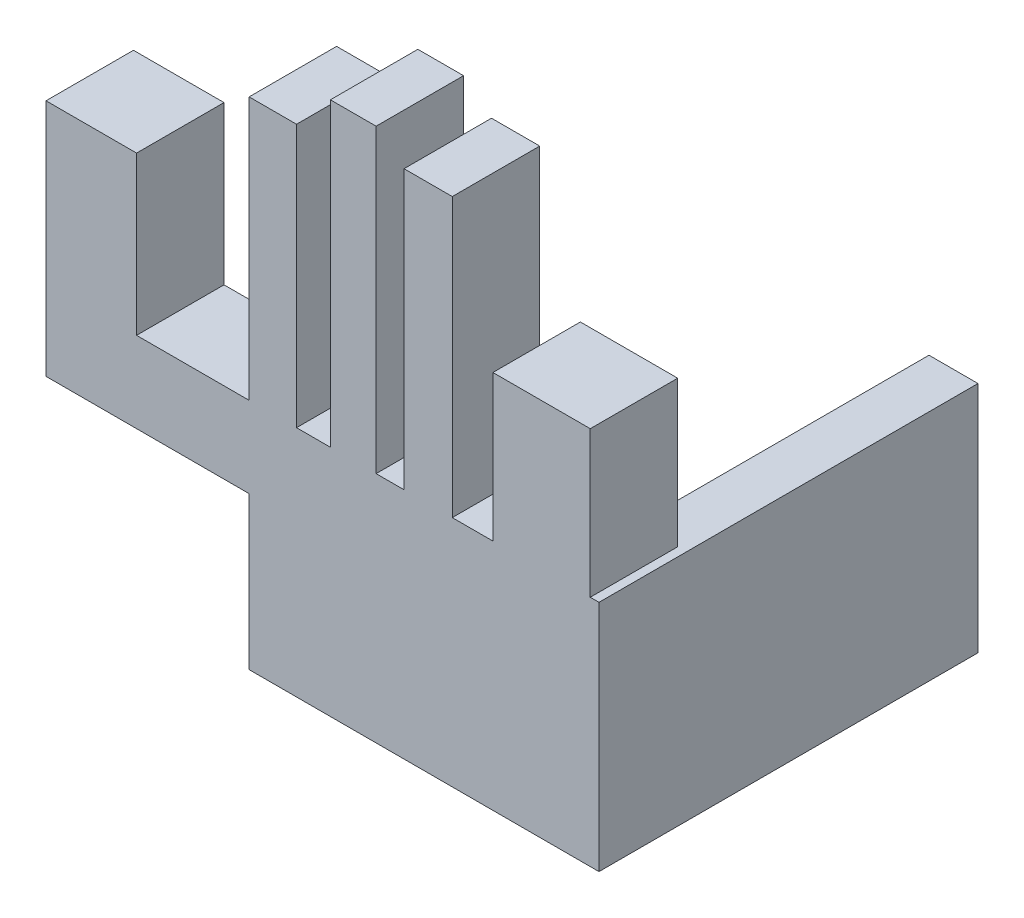
ISO-10303-21;
HEADER;
FILE_DESCRIPTION(('STEP AP214'),'2;1');
FILE_NAME('part.step','',(''),(''),'','','');
FILE_SCHEMA(('AUTOMOTIVE_DESIGN { 1 0 10303 214 1 1 1 1 }'));
ENDSEC;
DATA;
#1=APPLICATION_CONTEXT('core data for automotive mechanical design processes');
#2=APPLICATION_PROTOCOL_DEFINITION('international standard','automotive_design',2000,#1);
#3=PRODUCT_CONTEXT('',#1,'mechanical');
#4=PRODUCT('Part','Part','',(#3));
#5=PRODUCT_RELATED_PRODUCT_CATEGORY('part','',(#4));
#6=PRODUCT_DEFINITION_FORMATION('','',#4);
#7=PRODUCT_DEFINITION_CONTEXT('part definition',#1,'design');
#8=PRODUCT_DEFINITION('design','',#6,#7);
#9=PRODUCT_DEFINITION_SHAPE('','',#8);
#10=(LENGTH_UNIT() NAMED_UNIT(*) SI_UNIT(.MILLI.,.METRE.));
#11=(NAMED_UNIT(*) PLANE_ANGLE_UNIT() SI_UNIT($,.RADIAN.));
#12=(NAMED_UNIT(*) SI_UNIT($,.STERADIAN.) SOLID_ANGLE_UNIT());
#13=UNCERTAINTY_MEASURE_WITH_UNIT(LENGTH_MEASURE(1.E-05),#10,'distance_accuracy_value','');
#14=(GEOMETRIC_REPRESENTATION_CONTEXT(3) GLOBAL_UNCERTAINTY_ASSIGNED_CONTEXT((#13)) GLOBAL_UNIT_ASSIGNED_CONTEXT((#10,
#11,#12)) REPRESENTATION_CONTEXT('',''));
#15=CARTESIAN_POINT('',(0.,0.,0.));
#16=DIRECTION('',(0.,0.,1.));
#17=DIRECTION('',(1.,0.,0.));
#18=AXIS2_PLACEMENT_3D('',#15,#16,#17);
#19=CARTESIAN_POINT('',(0.,0.,15.));
#20=DIRECTION('',(1.,0.,0.));
#21=DIRECTION('',(0.,0.,-1.));
#22=AXIS2_PLACEMENT_3D('',#19,#20,#21);
#23=PLANE('',#22);
#24=DIRECTION('',(0.,-1.,0.));
#25=VECTOR('',#24,1.);
#26=CARTESIAN_POINT('',(0.,0.,0.));
#27=LINE('',#26,#25);
#28=CARTESIAN_POINT('',(0.,45.0725806451613,0.));
#29=VERTEX_POINT('',#28);
#30=CARTESIAN_POINT('',(0.,0.,0.));
#31=VERTEX_POINT('',#30);
#32=EDGE_CURVE('E288',#29,#31,#27,.T.);
#33=ORIENTED_EDGE('',*,*,#32,.T.);
#34=DIRECTION('',(0.,0.,-1.));
#35=VECTOR('',#34,1.);
#36=CARTESIAN_POINT('',(0.,0.,15.));
#37=LINE('',#36,#35);
#38=CARTESIAN_POINT('',(0.,0.,15.));
#39=VERTEX_POINT('',#38);
#40=EDGE_CURVE('E11',#39,#31,#37,.T.);
#41=ORIENTED_EDGE('',*,*,#40,.F.);
#42=DIRECTION('',(0.,-1.,0.));
#43=VECTOR('',#42,1.);
#44=CARTESIAN_POINT('',(0.,0.,15.));
#45=LINE('',#44,#43);
#46=CARTESIAN_POINT('',(0.,45.0725806451613,15.));
#47=VERTEX_POINT('',#46);
#48=EDGE_CURVE('E289',#47,#39,#45,.T.);
#49=ORIENTED_EDGE('',*,*,#48,.F.);
#50=DIRECTION('',(0.,0.,-1.));
#51=VECTOR('',#50,1.);
#52=CARTESIAN_POINT('',(0.,45.0725806451613,15.));
#53=LINE('',#52,#51);
#54=EDGE_CURVE('E339',#47,#29,#53,.T.);
#55=ORIENTED_EDGE('',*,*,#54,.T.);
#56=EDGE_LOOP('',(#33,#41,#49,#55));
#57=FACE_BOUND('',#56,.T.);
#58=ADVANCED_FACE('F33',(#57),#23,.F.);
#59=CARTESIAN_POINT('',(0.,0.,15.));
#60=DIRECTION('',(0.,-1.,0.));
#61=DIRECTION('',(0.,0.,-1.));
#62=AXIS2_PLACEMENT_3D('',#59,#60,#61);
#63=PLANE('',#62);
#64=DIRECTION('',(-1.,0.,0.));
#65=VECTOR('',#64,1.);
#66=CARTESIAN_POINT('',(0.,0.,0.));
#67=LINE('',#66,#65);
#68=CARTESIAN_POINT('',(-19.3064516129032,0.,0.));
#69=VERTEX_POINT('',#68);
#70=EDGE_CURVE('E342',#31,#69,#67,.T.);
#71=ORIENTED_EDGE('',*,*,#70,.T.);
#72=DIRECTION('',(0.,0.,-1.));
#73=VECTOR('',#72,1.);
#74=CARTESIAN_POINT('',(-19.3064516129032,0.,15.));
#75=LINE('',#74,#73);
#76=CARTESIAN_POINT('',(-19.3064516129032,0.,15.));
#77=VERTEX_POINT('',#76);
#78=EDGE_CURVE('E40',#77,#69,#75,.T.);
#79=ORIENTED_EDGE('',*,*,#78,.F.);
#80=DIRECTION('',(-1.,0.,0.));
#81=VECTOR('',#80,1.);
#82=CARTESIAN_POINT('',(0.,0.,15.));
#83=LINE('',#82,#81);
#84=EDGE_CURVE('E292',#39,#77,#83,.T.);
#85=ORIENTED_EDGE('',*,*,#84,.F.);
#86=ORIENTED_EDGE('',*,*,#40,.T.);
#87=EDGE_LOOP('',(#71,#79,#85,#86));
#88=FACE_BOUND('',#87,.T.);
#89=ADVANCED_FACE('F471',(#88),#63,.F.);
#90=CARTESIAN_POINT('',(-19.3064516129032,0.,15.));
#91=DIRECTION('',(-1.,0.,0.));
#92=DIRECTION('',(0.,0.,1.));
#93=AXIS2_PLACEMENT_3D('',#90,#91,#92);
#94=PLANE('',#93);
#95=DIRECTION('',(0.,1.,0.));
#96=VECTOR('',#95,1.);
#97=CARTESIAN_POINT('',(-19.3064516129032,0.,0.));
#98=LINE('',#97,#96);
#99=CARTESIAN_POINT('',(-19.3064516129032,27.0725806451613,0.));
#100=VERTEX_POINT('',#99);
#101=EDGE_CURVE('E344',#69,#100,#98,.T.);
#102=ORIENTED_EDGE('',*,*,#101,.T.);
#103=DIRECTION('',(0.,0.,-1.));
#104=VECTOR('',#103,1.);
#105=CARTESIAN_POINT('',(-19.3064516129032,27.0725806451613,15.));
#106=LINE('',#105,#104);
#107=CARTESIAN_POINT('',(-19.3064516129032,27.0725806451613,15.));
#108=VERTEX_POINT('',#107);
#109=EDGE_CURVE('E443',#108,#100,#106,.T.);
#110=ORIENTED_EDGE('',*,*,#109,.F.);
#111=DIRECTION('',(0.,1.,0.));
#112=VECTOR('',#111,1.);
#113=CARTESIAN_POINT('',(-19.3064516129032,0.,15.));
#114=LINE('',#113,#112);
#115=EDGE_CURVE('E295',#77,#108,#114,.T.);
#116=ORIENTED_EDGE('',*,*,#115,.F.);
#117=ORIENTED_EDGE('',*,*,#78,.T.);
#118=EDGE_LOOP('',(#102,#110,#116,#117));
#119=FACE_BOUND('',#118,.T.);
#120=ADVANCED_FACE('F450',(#119),#94,.F.);
#121=CARTESIAN_POINT('',(-34.8387096774194,27.0725806451613,15.));
#122=DIRECTION('',(0.,-1.,0.));
#123=DIRECTION('',(0.,0.,-1.));
#124=AXIS2_PLACEMENT_3D('',#121,#122,#123);
#125=PLANE('',#124);
#126=DIRECTION('',(-1.,0.,0.));
#127=VECTOR('',#126,1.);
#128=CARTESIAN_POINT('',(-34.8387096774194,27.0725806451613,0.));
#129=LINE('',#128,#127);
#130=CARTESIAN_POINT('',(-34.8387096774194,27.0725806451613,0.));
#131=VERTEX_POINT('',#130);
#132=EDGE_CURVE('E346',#100,#131,#129,.T.);
#133=ORIENTED_EDGE('',*,*,#132,.T.);
#134=DIRECTION('',(0.,0.,-1.));
#135=VECTOR('',#134,1.);
#136=CARTESIAN_POINT('',(-34.8387096774194,27.0725806451613,15.));
#137=LINE('',#136,#135);
#138=CARTESIAN_POINT('',(-34.8387096774194,27.0725806451613,15.));
#139=VERTEX_POINT('',#138);
#140=EDGE_CURVE('E440',#139,#131,#137,.T.);
#141=ORIENTED_EDGE('',*,*,#140,.F.);
#142=DIRECTION('',(-1.,0.,0.));
#143=VECTOR('',#142,1.);
#144=CARTESIAN_POINT('',(-34.8387096774194,27.0725806451613,15.));
#145=LINE('',#144,#143);
#146=EDGE_CURVE('E297',#108,#139,#145,.T.);
#147=ORIENTED_EDGE('',*,*,#146,.F.);
#148=ORIENTED_EDGE('',*,*,#109,.T.);
#149=EDGE_LOOP('',(#133,#141,#147,#148));
#150=FACE_BOUND('',#149,.T.);
#151=ADVANCED_FACE('F459',(#150),#125,.F.);
#152=CARTESIAN_POINT('',(-34.8387096774194,0.,15.));
#153=DIRECTION('',(1.,0.,0.));
#154=DIRECTION('',(0.,0.,-1.));
#155=AXIS2_PLACEMENT_3D('',#152,#153,#154);
#156=PLANE('',#155);
#157=DIRECTION('',(0.,-1.,0.));
#158=VECTOR('',#157,1.);
#159=CARTESIAN_POINT('',(-34.8387096774194,0.,0.));
#160=LINE('',#159,#158);
#161=CARTESIAN_POINT('',(-34.8387096774194,-13.8629032258065,0.));
#162=VERTEX_POINT('',#161);
#163=EDGE_CURVE('E349',#131,#162,#160,.T.);
#164=ORIENTED_EDGE('',*,*,#163,.T.);
#165=DIRECTION('',(0.,0.,-1.));
#166=VECTOR('',#165,1.);
#167=CARTESIAN_POINT('',(-34.8387096774194,-13.8629032258065,15.));
#168=LINE('',#167,#166);
#169=CARTESIAN_POINT('',(-34.8387096774194,-13.8629032258065,15.));
#170=VERTEX_POINT('',#169);
#171=EDGE_CURVE('E437',#170,#162,#168,.T.);
#172=ORIENTED_EDGE('',*,*,#171,.F.);
#173=DIRECTION('',(0.,-1.,0.));
#174=VECTOR('',#173,1.);
#175=CARTESIAN_POINT('',(-34.8387096774194,0.,15.));
#176=LINE('',#175,#174);
#177=EDGE_CURVE('E299',#139,#170,#176,.T.);
#178=ORIENTED_EDGE('',*,*,#177,.F.);
#179=ORIENTED_EDGE('',*,*,#140,.T.);
#180=EDGE_LOOP('',(#164,#172,#178,#179));
#181=FACE_BOUND('',#180,.T.);
#182=ADVANCED_FACE('F463',(#181),#156,.F.);
#183=CARTESIAN_POINT('',(0.,-13.8629032258065,15.));
#184=DIRECTION('',(0.,1.,0.));
#185=DIRECTION('',(0.,0.,1.));
#186=AXIS2_PLACEMENT_3D('',#183,#184,#185);
#187=PLANE('',#186);
#188=DIRECTION('',(1.,0.,0.));
#189=VECTOR('',#188,1.);
#190=CARTESIAN_POINT('',(0.,-13.8629032258065,0.));
#191=LINE('',#190,#189);
#192=CARTESIAN_POINT('',(0.,-13.8629032258065,0.));
#193=VERTEX_POINT('',#192);
#194=EDGE_CURVE('E351',#162,#193,#191,.T.);
#195=ORIENTED_EDGE('',*,*,#194,.T.);
#196=DIRECTION('',(0.,0.,-1.));
#197=VECTOR('',#196,1.);
#198=CARTESIAN_POINT('',(0.,-13.8629032258065,15.));
#199=LINE('',#198,#197);
#200=CARTESIAN_POINT('',(0.,-13.8629032258065,15.));
#201=VERTEX_POINT('',#200);
#202=EDGE_CURVE('E434',#201,#193,#199,.T.);
#203=ORIENTED_EDGE('',*,*,#202,.F.);
#204=DIRECTION('',(1.,0.,0.));
#205=VECTOR('',#204,1.);
#206=CARTESIAN_POINT('',(0.,-13.8629032258065,15.));
#207=LINE('',#206,#205);
#208=EDGE_CURVE('E301',#170,#201,#207,.T.);
#209=ORIENTED_EDGE('',*,*,#208,.F.);
#210=ORIENTED_EDGE('',*,*,#171,.T.);
#211=EDGE_LOOP('',(#195,#203,#209,#210));
#212=FACE_BOUND('',#211,.T.);
#213=ADVANCED_FACE('F564',(#212),#187,.F.);
#214=CARTESIAN_POINT('',(0.,-13.8629032258065,15.));
#215=DIRECTION('',(1.,0.,0.));
#216=DIRECTION('',(0.,1.,0.));
#217=AXIS2_PLACEMENT_3D('',#214,#215,#216);
#218=PLANE('',#217);
#219=DIRECTION('',(0.,-1.,0.));
#220=VECTOR('',#219,1.);
#221=CARTESIAN_POINT('',(0.,-13.8629032258065,0.));
#222=LINE('',#221,#220);
#223=CARTESIAN_POINT('',(0.,-40.,0.));
#224=VERTEX_POINT('',#223);
#225=EDGE_CURVE('E353',#193,#224,#222,.T.);
#226=ORIENTED_EDGE('',*,*,#225,.T.);
#227=DIRECTION('',(0.,0.,-1.));
#228=VECTOR('',#227,1.);
#229=CARTESIAN_POINT('',(0.,-40.,15.));
#230=LINE('',#229,#228);
#231=CARTESIAN_POINT('',(0.,-40.,15.));
#232=VERTEX_POINT('',#231);
#233=EDGE_CURVE('E431',#232,#224,#230,.T.);
#234=ORIENTED_EDGE('',*,*,#233,.F.);
#235=DIRECTION('',(0.,-1.,0.));
#236=VECTOR('',#235,1.);
#237=CARTESIAN_POINT('',(0.,-13.8629032258065,15.));
#238=LINE('',#237,#236);
#239=EDGE_CURVE('E303',#201,#232,#238,.T.);
#240=ORIENTED_EDGE('',*,*,#239,.F.);
#241=ORIENTED_EDGE('',*,*,#202,.T.);
#242=EDGE_LOOP('',(#226,#234,#240,#241));
#243=FACE_BOUND('',#242,.T.);
#244=ADVANCED_FACE('F561',(#243),#218,.F.);
#245=CARTESIAN_POINT('',(0.,-40.,15.));
#246=DIRECTION('',(0.,1.,0.));
#247=DIRECTION('',(0.,0.,1.));
#248=AXIS2_PLACEMENT_3D('',#245,#246,#247);
#249=PLANE('',#248);
#250=DIRECTION('',(1.,0.,0.));
#251=VECTOR('',#250,1.);
#252=CARTESIAN_POINT('',(0.,-40.,0.));
#253=LINE('',#252,#251);
#254=CARTESIAN_POINT('',(51.5954666608115,-40.,0.));
#255=VERTEX_POINT('',#254);
#256=EDGE_CURVE('E355',#224,#255,#253,.T.);
#257=ORIENTED_EDGE('',*,*,#256,.T.);
#258=DIRECTION('',(0.,0.,1.));
#259=VECTOR('',#258,1.);
#260=CARTESIAN_POINT('',(51.5954666608115,-40.,-50.));
#261=LINE('',#260,#259);
#262=CARTESIAN_POINT('',(51.5954666608115,-40.,-50.));
#263=VERTEX_POINT('',#262);
#264=EDGE_CURVE('E285',#263,#255,#261,.T.);
#265=ORIENTED_EDGE('',*,*,#264,.F.);
#266=DIRECTION('',(-1.,0.,0.));
#267=VECTOR('',#266,1.);
#268=CARTESIAN_POINT('',(60.,-40.,-50.));
#269=LINE('',#268,#267);
#270=CARTESIAN_POINT('',(60.,-40.,-50.));
#271=VERTEX_POINT('',#270);
#272=EDGE_CURVE('E271',#271,#263,#269,.T.);
#273=ORIENTED_EDGE('',*,*,#272,.F.);
#274=DIRECTION('',(0.,0.,-1.));
#275=VECTOR('',#274,1.);
#276=CARTESIAN_POINT('',(60.,-40.,15.));
#277=LINE('',#276,#275);
#278=CARTESIAN_POINT('',(60.,-40.,15.));
#279=VERTEX_POINT('',#278);
#280=EDGE_CURVE('E429',#279,#271,#277,.T.);
#281=ORIENTED_EDGE('',*,*,#280,.F.);
#282=DIRECTION('',(1.,0.,0.));
#283=VECTOR('',#282,1.);
#284=CARTESIAN_POINT('',(0.,-40.,15.));
#285=LINE('',#284,#283);
#286=EDGE_CURVE('E305',#232,#279,#285,.T.);
#287=ORIENTED_EDGE('',*,*,#286,.F.);
#288=ORIENTED_EDGE('',*,*,#233,.T.);
#289=EDGE_LOOP('',(#257,#265,#273,#281,#287,#288));
#290=FACE_BOUND('',#289,.T.);
#291=ADVANCED_FACE('F555',(#290),#249,.F.);
#292=CARTESIAN_POINT('',(60.,0.,15.));
#293=DIRECTION('',(-1.,0.,0.));
#294=DIRECTION('',(0.,-1.,0.));
#295=AXIS2_PLACEMENT_3D('',#292,#293,#294);
#296=PLANE('',#295);
#297=ORIENTED_EDGE('',*,*,#280,.T.);
#298=DIRECTION('',(0.,-1.,0.));
#299=VECTOR('',#298,1.);
#300=CARTESIAN_POINT('',(60.,0.,-50.));
#301=LINE('',#300,#299);
#302=CARTESIAN_POINT('',(60.,0.,-50.));
#303=VERTEX_POINT('',#302);
#304=EDGE_CURVE('E268',#303,#271,#301,.T.);
#305=ORIENTED_EDGE('',*,*,#304,.F.);
#306=DIRECTION('',(0.,0.,-1.));
#307=VECTOR('',#306,1.);
#308=CARTESIAN_POINT('',(60.,0.,15.));
#309=LINE('',#308,#307);
#310=CARTESIAN_POINT('',(60.,0.,15.));
#311=VERTEX_POINT('',#310);
#312=EDGE_CURVE('E427',#311,#303,#309,.T.);
#313=ORIENTED_EDGE('',*,*,#312,.F.);
#314=DIRECTION('',(0.,1.,0.));
#315=VECTOR('',#314,1.);
#316=CARTESIAN_POINT('',(60.,0.,15.));
#317=LINE('',#316,#315);
#318=EDGE_CURVE('E307',#279,#311,#317,.T.);
#319=ORIENTED_EDGE('',*,*,#318,.F.);
#320=EDGE_LOOP('',(#297,#305,#313,#319));
#321=FACE_BOUND('',#320,.T.);
#322=ADVANCED_FACE('F728',(#321),#296,.F.);
#323=CARTESIAN_POINT('',(58.5,0.,15.));
#324=DIRECTION('',(0.,-1.,0.));
#325=DIRECTION('',(0.,0.,-1.));
#326=AXIS2_PLACEMENT_3D('',#323,#324,#325);
#327=PLANE('',#326);
#328=ORIENTED_EDGE('',*,*,#312,.T.);
#329=DIRECTION('',(1.,0.,0.));
#330=VECTOR('',#329,1.);
#331=CARTESIAN_POINT('',(60.,0.,-50.));
#332=LINE('',#331,#330);
#333=CARTESIAN_POINT('',(51.5954666608115,0.,-50.));
#334=VERTEX_POINT('',#333);
#335=EDGE_CURVE('E276',#334,#303,#332,.T.);
#336=ORIENTED_EDGE('',*,*,#335,.F.);
#337=DIRECTION('',(0.,0.,1.));
#338=VECTOR('',#337,1.);
#339=CARTESIAN_POINT('',(51.5954666608115,0.,-50.));
#340=LINE('',#339,#338);
#341=CARTESIAN_POINT('',(51.5954666608115,0.,0.));
#342=VERTEX_POINT('',#341);
#343=EDGE_CURVE('E279',#334,#342,#340,.T.);
#344=ORIENTED_EDGE('',*,*,#343,.T.);
#345=DIRECTION('',(1.,0.,0.));
#346=VECTOR('',#345,1.);
#347=CARTESIAN_POINT('',(60.,0.,0.));
#348=LINE('',#347,#346);
#349=CARTESIAN_POINT('',(58.5,0.,0.));
#350=VERTEX_POINT('',#349);
#351=EDGE_CURVE('E272',#342,#350,#348,.T.);
#352=ORIENTED_EDGE('',*,*,#351,.T.);
#353=DIRECTION('',(0.,0.,-1.));
#354=VECTOR('',#353,1.);
#355=CARTESIAN_POINT('',(58.5,0.,15.));
#356=LINE('',#355,#354);
#357=CARTESIAN_POINT('',(58.5,0.,15.));
#358=VERTEX_POINT('',#357);
#359=EDGE_CURVE('E425',#358,#350,#356,.T.);
#360=ORIENTED_EDGE('',*,*,#359,.F.);
#361=DIRECTION('',(-1.,0.,0.));
#362=VECTOR('',#361,1.);
#363=CARTESIAN_POINT('',(58.5,0.,15.));
#364=LINE('',#363,#362);
#365=EDGE_CURVE('E309',#311,#358,#364,.T.);
#366=ORIENTED_EDGE('',*,*,#365,.F.);
#367=EDGE_LOOP('',(#328,#336,#344,#352,#360,#366));
#368=FACE_BOUND('',#367,.T.);
#369=ADVANCED_FACE('F546',(#368),#327,.F.);
#370=CARTESIAN_POINT('',(58.5,0.,15.));
#371=DIRECTION('',(-1.,0.,0.));
#372=DIRECTION('',(0.,0.,1.));
#373=AXIS2_PLACEMENT_3D('',#370,#371,#372);
#374=PLANE('',#373);
#375=DIRECTION('',(0.,1.,0.));
#376=VECTOR('',#375,1.);
#377=CARTESIAN_POINT('',(58.5,0.,0.));
#378=LINE('',#377,#376);
#379=CARTESIAN_POINT('',(58.5,25.0403225806452,0.));
#380=VERTEX_POINT('',#379);
#381=EDGE_CURVE('E357',#350,#380,#378,.T.);
#382=ORIENTED_EDGE('',*,*,#381,.T.);
#383=DIRECTION('',(0.,0.,-1.));
#384=VECTOR('',#383,1.);
#385=CARTESIAN_POINT('',(58.5,25.0403225806452,15.));
#386=LINE('',#385,#384);
#387=CARTESIAN_POINT('',(58.5,25.0403225806452,15.));
#388=VERTEX_POINT('',#387);
#389=EDGE_CURVE('E422',#388,#380,#386,.T.);
#390=ORIENTED_EDGE('',*,*,#389,.F.);
#391=DIRECTION('',(0.,1.,0.));
#392=VECTOR('',#391,1.);
#393=CARTESIAN_POINT('',(58.5,0.,15.));
#394=LINE('',#393,#392);
#395=EDGE_CURVE('E311',#358,#388,#394,.T.);
#396=ORIENTED_EDGE('',*,*,#395,.F.);
#397=ORIENTED_EDGE('',*,*,#359,.T.);
#398=EDGE_LOOP('',(#382,#390,#396,#397));
#399=FACE_BOUND('',#398,.T.);
#400=ADVANCED_FACE('F542',(#399),#374,.F.);
#401=CARTESIAN_POINT('',(41.8064516129033,25.0403225806452,15.));
#402=DIRECTION('',(0.,-1.,0.));
#403=DIRECTION('',(0.,0.,-1.));
#404=AXIS2_PLACEMENT_3D('',#401,#402,#403);
#405=PLANE('',#404);
#406=DIRECTION('',(-1.,0.,0.));
#407=VECTOR('',#406,1.);
#408=CARTESIAN_POINT('',(41.8064516129033,25.0403225806452,0.));
#409=LINE('',#408,#407);
#410=CARTESIAN_POINT('',(41.8064516129033,25.0403225806452,0.));
#411=VERTEX_POINT('',#410);
#412=EDGE_CURVE('E359',#380,#411,#409,.T.);
#413=ORIENTED_EDGE('',*,*,#412,.T.);
#414=DIRECTION('',(0.,0.,-1.));
#415=VECTOR('',#414,1.);
#416=CARTESIAN_POINT('',(41.8064516129033,25.0403225806452,15.));
#417=LINE('',#416,#415);
#418=CARTESIAN_POINT('',(41.8064516129033,25.0403225806452,15.));
#419=VERTEX_POINT('',#418);
#420=EDGE_CURVE('E419',#419,#411,#417,.T.);
#421=ORIENTED_EDGE('',*,*,#420,.F.);
#422=DIRECTION('',(-1.,0.,0.));
#423=VECTOR('',#422,1.);
#424=CARTESIAN_POINT('',(41.8064516129033,25.0403225806452,15.));
#425=LINE('',#424,#423);
#426=EDGE_CURVE('E313',#388,#419,#425,.T.);
#427=ORIENTED_EDGE('',*,*,#426,.F.);
#428=ORIENTED_EDGE('',*,*,#389,.T.);
#429=EDGE_LOOP('',(#413,#421,#427,#428));
#430=FACE_BOUND('',#429,.T.);
#431=ADVANCED_FACE('F537',(#430),#405,.F.);
#432=CARTESIAN_POINT('',(41.8064516129033,0.,15.));
#433=DIRECTION('',(1.,0.,0.));
#434=DIRECTION('',(0.,0.,-1.));
#435=AXIS2_PLACEMENT_3D('',#432,#433,#434);
#436=PLANE('',#435);
#437=DIRECTION('',(0.,-1.,0.));
#438=VECTOR('',#437,1.);
#439=CARTESIAN_POINT('',(41.8064516129033,0.,0.));
#440=LINE('',#439,#438);
#441=CARTESIAN_POINT('',(41.8064516129033,0.,0.));
#442=VERTEX_POINT('',#441);
#443=EDGE_CURVE('E361',#411,#442,#440,.T.);
#444=ORIENTED_EDGE('',*,*,#443,.T.);
#445=DIRECTION('',(0.,0.,-1.));
#446=VECTOR('',#445,1.);
#447=CARTESIAN_POINT('',(41.8064516129033,0.,15.));
#448=LINE('',#447,#446);
#449=CARTESIAN_POINT('',(41.8064516129033,0.,15.));
#450=VERTEX_POINT('',#449);
#451=EDGE_CURVE('E416',#450,#442,#448,.T.);
#452=ORIENTED_EDGE('',*,*,#451,.F.);
#453=DIRECTION('',(0.,-1.,0.));
#454=VECTOR('',#453,1.);
#455=CARTESIAN_POINT('',(41.8064516129033,0.,15.));
#456=LINE('',#455,#454);
#457=EDGE_CURVE('E315',#419,#450,#456,.T.);
#458=ORIENTED_EDGE('',*,*,#457,.F.);
#459=ORIENTED_EDGE('',*,*,#420,.T.);
#460=EDGE_LOOP('',(#444,#452,#458,#459));
#461=FACE_BOUND('',#460,.T.);
#462=ADVANCED_FACE('F532',(#461),#436,.F.);
#463=CARTESIAN_POINT('',(34.8387096774194,0.,15.));
#464=DIRECTION('',(0.,-1.,0.));
#465=DIRECTION('',(0.,0.,-1.));
#466=AXIS2_PLACEMENT_3D('',#463,#464,#465);
#467=PLANE('',#466);
#468=DIRECTION('',(-1.,0.,0.));
#469=VECTOR('',#468,1.);
#470=CARTESIAN_POINT('',(34.8387096774194,0.,0.));
#471=LINE('',#470,#469);
#472=CARTESIAN_POINT('',(34.8387096774194,0.,0.));
#473=VERTEX_POINT('',#472);
#474=EDGE_CURVE('E363',#442,#473,#471,.T.);
#475=ORIENTED_EDGE('',*,*,#474,.T.);
#476=DIRECTION('',(0.,0.,-1.));
#477=VECTOR('',#476,1.);
#478=CARTESIAN_POINT('',(34.8387096774194,0.,15.));
#479=LINE('',#478,#477);
#480=CARTESIAN_POINT('',(34.8387096774194,0.,15.));
#481=VERTEX_POINT('',#480);
#482=EDGE_CURVE('E413',#481,#473,#479,.T.);
#483=ORIENTED_EDGE('',*,*,#482,.F.);
#484=DIRECTION('',(-1.,0.,0.));
#485=VECTOR('',#484,1.);
#486=CARTESIAN_POINT('',(34.8387096774194,0.,15.));
#487=LINE('',#486,#485);
#488=EDGE_CURVE('E317',#450,#481,#487,.T.);
#489=ORIENTED_EDGE('',*,*,#488,.F.);
#490=ORIENTED_EDGE('',*,*,#451,.T.);
#491=EDGE_LOOP('',(#475,#483,#489,#490));
#492=FACE_BOUND('',#491,.T.);
#493=ADVANCED_FACE('F528',(#492),#467,.F.);
#494=CARTESIAN_POINT('',(34.8387096774194,0.,15.));
#495=DIRECTION('',(-1.,0.,0.));
#496=DIRECTION('',(0.,0.,1.));
#497=AXIS2_PLACEMENT_3D('',#494,#495,#496);
#498=PLANE('',#497);
#499=DIRECTION('',(0.,1.,0.));
#500=VECTOR('',#499,1.);
#501=CARTESIAN_POINT('',(34.8387096774194,0.,0.));
#502=LINE('',#501,#500);
#503=CARTESIAN_POINT('',(34.8387096774194,47.6854838709678,0.));
#504=VERTEX_POINT('',#503);
#505=EDGE_CURVE('E365',#473,#504,#502,.T.);
#506=ORIENTED_EDGE('',*,*,#505,.T.);
#507=DIRECTION('',(0.,0.,-1.));
#508=VECTOR('',#507,1.);
#509=CARTESIAN_POINT('',(34.8387096774194,47.6854838709678,15.));
#510=LINE('',#509,#508);
#511=CARTESIAN_POINT('',(34.8387096774194,47.6854838709678,15.));
#512=VERTEX_POINT('',#511);
#513=EDGE_CURVE('E410',#512,#504,#510,.T.);
#514=ORIENTED_EDGE('',*,*,#513,.F.);
#515=DIRECTION('',(0.,1.,0.));
#516=VECTOR('',#515,1.);
#517=CARTESIAN_POINT('',(34.8387096774194,0.,15.));
#518=LINE('',#517,#516);
#519=EDGE_CURVE('E319',#481,#512,#518,.T.);
#520=ORIENTED_EDGE('',*,*,#519,.F.);
#521=ORIENTED_EDGE('',*,*,#482,.T.);
#522=EDGE_LOOP('',(#506,#514,#520,#521));
#523=FACE_BOUND('',#522,.T.);
#524=ADVANCED_FACE('F523',(#523),#498,.F.);
#525=CARTESIAN_POINT('',(26.5645161290323,47.6854838709678,15.));
#526=DIRECTION('',(0.,-1.,0.));
#527=DIRECTION('',(0.,0.,-1.));
#528=AXIS2_PLACEMENT_3D('',#525,#526,#527);
#529=PLANE('',#528);
#530=DIRECTION('',(-1.,0.,0.));
#531=VECTOR('',#530,1.);
#532=CARTESIAN_POINT('',(26.5645161290323,47.6854838709678,0.));
#533=LINE('',#532,#531);
#534=CARTESIAN_POINT('',(26.5645161290323,47.6854838709678,0.));
#535=VERTEX_POINT('',#534);
#536=EDGE_CURVE('E367',#504,#535,#533,.T.);
#537=ORIENTED_EDGE('',*,*,#536,.T.);
#538=DIRECTION('',(0.,0.,-1.));
#539=VECTOR('',#538,1.);
#540=CARTESIAN_POINT('',(26.5645161290323,47.6854838709678,15.));
#541=LINE('',#540,#539);
#542=CARTESIAN_POINT('',(26.5645161290323,47.6854838709678,15.));
#543=VERTEX_POINT('',#542);
#544=EDGE_CURVE('E407',#543,#535,#541,.T.);
#545=ORIENTED_EDGE('',*,*,#544,.F.);
#546=DIRECTION('',(-1.,0.,0.));
#547=VECTOR('',#546,1.);
#548=CARTESIAN_POINT('',(26.5645161290323,47.6854838709678,15.));
#549=LINE('',#548,#547);
#550=EDGE_CURVE('E321',#512,#543,#549,.T.);
#551=ORIENTED_EDGE('',*,*,#550,.F.);
#552=ORIENTED_EDGE('',*,*,#513,.T.);
#553=EDGE_LOOP('',(#537,#545,#551,#552));
#554=FACE_BOUND('',#553,.T.);
#555=ADVANCED_FACE('F517',(#554),#529,.F.);
#556=CARTESIAN_POINT('',(26.5645161290323,0.,15.));
#557=DIRECTION('',(1.,0.,0.));
#558=DIRECTION('',(0.,0.,-1.));
#559=AXIS2_PLACEMENT_3D('',#556,#557,#558);
#560=PLANE('',#559);
#561=DIRECTION('',(0.,-1.,0.));
#562=VECTOR('',#561,1.);
#563=CARTESIAN_POINT('',(26.5645161290323,0.,0.));
#564=LINE('',#563,#562);
#565=CARTESIAN_POINT('',(26.5645161290323,0.,0.));
#566=VERTEX_POINT('',#565);
#567=EDGE_CURVE('E369',#535,#566,#564,.T.);
#568=ORIENTED_EDGE('',*,*,#567,.T.);
#569=DIRECTION('',(0.,0.,-1.));
#570=VECTOR('',#569,1.);
#571=CARTESIAN_POINT('',(26.5645161290323,0.,15.));
#572=LINE('',#571,#570);
#573=CARTESIAN_POINT('',(26.5645161290323,0.,15.));
#574=VERTEX_POINT('',#573);
#575=EDGE_CURVE('E404',#574,#566,#572,.T.);
#576=ORIENTED_EDGE('',*,*,#575,.F.);
#577=DIRECTION('',(0.,-1.,0.));
#578=VECTOR('',#577,1.);
#579=CARTESIAN_POINT('',(26.5645161290323,0.,15.));
#580=LINE('',#579,#578);
#581=EDGE_CURVE('E323',#543,#574,#580,.T.);
#582=ORIENTED_EDGE('',*,*,#581,.F.);
#583=ORIENTED_EDGE('',*,*,#544,.T.);
#584=EDGE_LOOP('',(#568,#576,#582,#583));
#585=FACE_BOUND('',#584,.T.);
#586=ADVANCED_FACE('F513',(#585),#560,.F.);
#587=CARTESIAN_POINT('',(21.7741935483871,0.,15.));
#588=DIRECTION('',(0.,-1.,0.));
#589=DIRECTION('',(0.,0.,-1.));
#590=AXIS2_PLACEMENT_3D('',#587,#588,#589);
#591=PLANE('',#590);
#592=DIRECTION('',(-1.,0.,0.));
#593=VECTOR('',#592,1.);
#594=CARTESIAN_POINT('',(21.7741935483871,0.,0.));
#595=LINE('',#594,#593);
#596=CARTESIAN_POINT('',(21.7741935483871,0.,0.));
#597=VERTEX_POINT('',#596);
#598=EDGE_CURVE('E371',#566,#597,#595,.T.);
#599=ORIENTED_EDGE('',*,*,#598,.T.);
#600=DIRECTION('',(0.,0.,-1.));
#601=VECTOR('',#600,1.);
#602=CARTESIAN_POINT('',(21.7741935483871,0.,15.));
#603=LINE('',#602,#601);
#604=CARTESIAN_POINT('',(21.7741935483871,0.,15.));
#605=VERTEX_POINT('',#604);
#606=EDGE_CURVE('E401',#605,#597,#603,.T.);
#607=ORIENTED_EDGE('',*,*,#606,.F.);
#608=DIRECTION('',(-1.,0.,0.));
#609=VECTOR('',#608,1.);
#610=CARTESIAN_POINT('',(21.7741935483871,0.,15.));
#611=LINE('',#610,#609);
#612=EDGE_CURVE('E325',#574,#605,#611,.T.);
#613=ORIENTED_EDGE('',*,*,#612,.F.);
#614=ORIENTED_EDGE('',*,*,#575,.T.);
#615=EDGE_LOOP('',(#599,#607,#613,#614));
#616=FACE_BOUND('',#615,.T.);
#617=ADVANCED_FACE('F508',(#616),#591,.F.);
#618=CARTESIAN_POINT('',(21.7741935483871,0.,15.));
#619=DIRECTION('',(-1.,0.,0.));
#620=DIRECTION('',(0.,0.,1.));
#621=AXIS2_PLACEMENT_3D('',#618,#619,#620);
#622=PLANE('',#621);
#623=DIRECTION('',(0.,1.,0.));
#624=VECTOR('',#623,1.);
#625=CARTESIAN_POINT('',(21.7741935483871,0.,0.));
#626=LINE('',#625,#624);
#627=CARTESIAN_POINT('',(21.7741935483871,51.6048387096774,0.));
#628=VERTEX_POINT('',#627);
#629=EDGE_CURVE('E373',#597,#628,#626,.T.);
#630=ORIENTED_EDGE('',*,*,#629,.T.);
#631=DIRECTION('',(0.,0.,-1.));
#632=VECTOR('',#631,1.);
#633=CARTESIAN_POINT('',(21.7741935483871,51.6048387096774,15.));
#634=LINE('',#633,#632);
#635=CARTESIAN_POINT('',(21.7741935483871,51.6048387096774,15.));
#636=VERTEX_POINT('',#635);
#637=EDGE_CURVE('E398',#636,#628,#634,.T.);
#638=ORIENTED_EDGE('',*,*,#637,.F.);
#639=DIRECTION('',(0.,1.,0.));
#640=VECTOR('',#639,1.);
#641=CARTESIAN_POINT('',(21.7741935483871,0.,15.));
#642=LINE('',#641,#640);
#643=EDGE_CURVE('E327',#605,#636,#642,.T.);
#644=ORIENTED_EDGE('',*,*,#643,.F.);
#645=ORIENTED_EDGE('',*,*,#606,.T.);
#646=EDGE_LOOP('',(#630,#638,#644,#645));
#647=FACE_BOUND('',#646,.T.);
#648=ADVANCED_FACE('F502',(#647),#622,.F.);
#649=CARTESIAN_POINT('',(13.9354838709677,51.6048387096774,15.));
#650=DIRECTION('',(0.,-1.,0.));
#651=DIRECTION('',(0.,0.,-1.));
#652=AXIS2_PLACEMENT_3D('',#649,#650,#651);
#653=PLANE('',#652);
#654=DIRECTION('',(-1.,0.,0.));
#655=VECTOR('',#654,1.);
#656=CARTESIAN_POINT('',(13.9354838709677,51.6048387096774,0.));
#657=LINE('',#656,#655);
#658=CARTESIAN_POINT('',(13.9354838709677,51.6048387096774,0.));
#659=VERTEX_POINT('',#658);
#660=EDGE_CURVE('E375',#628,#659,#657,.T.);
#661=ORIENTED_EDGE('',*,*,#660,.T.);
#662=DIRECTION('',(0.,0.,-1.));
#663=VECTOR('',#662,1.);
#664=CARTESIAN_POINT('',(13.9354838709677,51.6048387096774,15.));
#665=LINE('',#664,#663);
#666=CARTESIAN_POINT('',(13.9354838709677,51.6048387096774,15.));
#667=VERTEX_POINT('',#666);
#668=EDGE_CURVE('E395',#667,#659,#665,.T.);
#669=ORIENTED_EDGE('',*,*,#668,.F.);
#670=DIRECTION('',(-1.,0.,0.));
#671=VECTOR('',#670,1.);
#672=CARTESIAN_POINT('',(13.9354838709677,51.6048387096774,15.));
#673=LINE('',#672,#671);
#674=EDGE_CURVE('E329',#636,#667,#673,.T.);
#675=ORIENTED_EDGE('',*,*,#674,.F.);
#676=ORIENTED_EDGE('',*,*,#637,.T.);
#677=EDGE_LOOP('',(#661,#669,#675,#676));
#678=FACE_BOUND('',#677,.T.);
#679=ADVANCED_FACE('F498',(#678),#653,.F.);
#680=CARTESIAN_POINT('',(13.9354838709677,0.,15.));
#681=DIRECTION('',(1.,0.,0.));
#682=DIRECTION('',(0.,0.,-1.));
#683=AXIS2_PLACEMENT_3D('',#680,#681,#682);
#684=PLANE('',#683);
#685=DIRECTION('',(0.,-1.,0.));
#686=VECTOR('',#685,1.);
#687=CARTESIAN_POINT('',(13.9354838709677,0.,0.));
#688=LINE('',#687,#686);
#689=CARTESIAN_POINT('',(13.9354838709677,0.,0.));
#690=VERTEX_POINT('',#689);
#691=EDGE_CURVE('E377',#659,#690,#688,.T.);
#692=ORIENTED_EDGE('',*,*,#691,.T.);
#693=DIRECTION('',(0.,0.,-1.));
#694=VECTOR('',#693,1.);
#695=CARTESIAN_POINT('',(13.9354838709677,0.,15.));
#696=LINE('',#695,#694);
#697=CARTESIAN_POINT('',(13.9354838709677,0.,15.));
#698=VERTEX_POINT('',#697);
#699=EDGE_CURVE('E392',#698,#690,#696,.T.);
#700=ORIENTED_EDGE('',*,*,#699,.F.);
#701=DIRECTION('',(0.,-1.,0.));
#702=VECTOR('',#701,1.);
#703=CARTESIAN_POINT('',(13.9354838709677,0.,15.));
#704=LINE('',#703,#702);
#705=EDGE_CURVE('E331',#667,#698,#704,.T.);
#706=ORIENTED_EDGE('',*,*,#705,.F.);
#707=ORIENTED_EDGE('',*,*,#668,.T.);
#708=EDGE_LOOP('',(#692,#700,#706,#707));
#709=FACE_BOUND('',#708,.T.);
#710=ADVANCED_FACE('F493',(#709),#684,.F.);
#711=CARTESIAN_POINT('',(8.12903225806452,0.,15.));
#712=DIRECTION('',(0.,-1.,0.));
#713=DIRECTION('',(0.,0.,-1.));
#714=AXIS2_PLACEMENT_3D('',#711,#712,#713);
#715=PLANE('',#714);
#716=DIRECTION('',(-1.,0.,0.));
#717=VECTOR('',#716,1.);
#718=CARTESIAN_POINT('',(8.12903225806452,0.,0.));
#719=LINE('',#718,#717);
#720=CARTESIAN_POINT('',(8.12903225806452,0.,0.));
#721=VERTEX_POINT('',#720);
#722=EDGE_CURVE('E379',#690,#721,#719,.T.);
#723=ORIENTED_EDGE('',*,*,#722,.T.);
#724=DIRECTION('',(0.,0.,-1.));
#725=VECTOR('',#724,1.);
#726=CARTESIAN_POINT('',(8.12903225806452,0.,15.));
#727=LINE('',#726,#725);
#728=CARTESIAN_POINT('',(8.12903225806452,0.,15.));
#729=VERTEX_POINT('',#728);
#730=EDGE_CURVE('E389',#729,#721,#727,.T.);
#731=ORIENTED_EDGE('',*,*,#730,.F.);
#732=DIRECTION('',(-1.,0.,0.));
#733=VECTOR('',#732,1.);
#734=CARTESIAN_POINT('',(8.12903225806452,0.,15.));
#735=LINE('',#734,#733);
#736=EDGE_CURVE('E333',#698,#729,#735,.T.);
#737=ORIENTED_EDGE('',*,*,#736,.F.);
#738=ORIENTED_EDGE('',*,*,#699,.T.);
#739=EDGE_LOOP('',(#723,#731,#737,#738));
#740=FACE_BOUND('',#739,.T.);
#741=ADVANCED_FACE('F487',(#740),#715,.F.);
#742=CARTESIAN_POINT('',(8.12903225806452,0.,15.));
#743=DIRECTION('',(-1.,0.,0.));
#744=DIRECTION('',(0.,0.,1.));
#745=AXIS2_PLACEMENT_3D('',#742,#743,#744);
#746=PLANE('',#745);
#747=DIRECTION('',(0.,1.,0.));
#748=VECTOR('',#747,1.);
#749=CARTESIAN_POINT('',(8.12903225806452,0.,0.));
#750=LINE('',#749,#748);
#751=CARTESIAN_POINT('',(8.12903225806452,45.0725806451613,0.));
#752=VERTEX_POINT('',#751);
#753=EDGE_CURVE('E381',#721,#752,#750,.T.);
#754=ORIENTED_EDGE('',*,*,#753,.T.);
#755=DIRECTION('',(0.,0.,-1.));
#756=VECTOR('',#755,1.);
#757=CARTESIAN_POINT('',(8.12903225806452,45.0725806451613,15.));
#758=LINE('',#757,#756);
#759=CARTESIAN_POINT('',(8.12903225806452,45.0725806451613,15.));
#760=VERTEX_POINT('',#759);
#761=EDGE_CURVE('E386',#760,#752,#758,.T.);
#762=ORIENTED_EDGE('',*,*,#761,.F.);
#763=DIRECTION('',(0.,1.,0.));
#764=VECTOR('',#763,1.);
#765=CARTESIAN_POINT('',(8.12903225806452,0.,15.));
#766=LINE('',#765,#764);
#767=EDGE_CURVE('E335',#729,#760,#766,.T.);
#768=ORIENTED_EDGE('',*,*,#767,.F.);
#769=ORIENTED_EDGE('',*,*,#730,.T.);
#770=EDGE_LOOP('',(#754,#762,#768,#769));
#771=FACE_BOUND('',#770,.T.);
#772=ADVANCED_FACE('F483',(#771),#746,.F.);
#773=CARTESIAN_POINT('',(0.,45.0725806451613,15.));
#774=DIRECTION('',(0.,-1.,0.));
#775=DIRECTION('',(0.,0.,-1.));
#776=AXIS2_PLACEMENT_3D('',#773,#774,#775);
#777=PLANE('',#776);
#778=DIRECTION('',(-1.,0.,0.));
#779=VECTOR('',#778,1.);
#780=CARTESIAN_POINT('',(0.,45.0725806451613,0.));
#781=LINE('',#780,#779);
#782=EDGE_CURVE('E293',#752,#29,#781,.T.);
#783=ORIENTED_EDGE('',*,*,#782,.T.);
#784=ORIENTED_EDGE('',*,*,#54,.F.);
#785=DIRECTION('',(-1.,0.,0.));
#786=VECTOR('',#785,1.);
#787=CARTESIAN_POINT('',(0.,45.0725806451613,15.));
#788=LINE('',#787,#786);
#789=EDGE_CURVE('E337',#760,#47,#788,.T.);
#790=ORIENTED_EDGE('',*,*,#789,.F.);
#791=ORIENTED_EDGE('',*,*,#761,.T.);
#792=EDGE_LOOP('',(#783,#784,#790,#791));
#793=FACE_BOUND('',#792,.T.);
#794=ADVANCED_FACE('F478',(#793),#777,.F.);
#795=CARTESIAN_POINT('',(0.,0.,15.));
#796=DIRECTION('',(0.,0.,-1.));
#797=DIRECTION('',(-1.,0.,0.));
#798=AXIS2_PLACEMENT_3D('',#795,#796,#797);
#799=PLANE('',#798);
#800=ORIENTED_EDGE('',*,*,#48,.T.);
#801=ORIENTED_EDGE('',*,*,#84,.T.);
#802=ORIENTED_EDGE('',*,*,#115,.T.);
#803=ORIENTED_EDGE('',*,*,#146,.T.);
#804=ORIENTED_EDGE('',*,*,#177,.T.);
#805=ORIENTED_EDGE('',*,*,#208,.T.);
#806=ORIENTED_EDGE('',*,*,#239,.T.);
#807=ORIENTED_EDGE('',*,*,#286,.T.);
#808=ORIENTED_EDGE('',*,*,#318,.T.);
#809=ORIENTED_EDGE('',*,*,#365,.T.);
#810=ORIENTED_EDGE('',*,*,#395,.T.);
#811=ORIENTED_EDGE('',*,*,#426,.T.);
#812=ORIENTED_EDGE('',*,*,#457,.T.);
#813=ORIENTED_EDGE('',*,*,#488,.T.);
#814=ORIENTED_EDGE('',*,*,#519,.T.);
#815=ORIENTED_EDGE('',*,*,#550,.T.);
#816=ORIENTED_EDGE('',*,*,#581,.T.);
#817=ORIENTED_EDGE('',*,*,#612,.T.);
#818=ORIENTED_EDGE('',*,*,#643,.T.);
#819=ORIENTED_EDGE('',*,*,#674,.T.);
#820=ORIENTED_EDGE('',*,*,#705,.T.);
#821=ORIENTED_EDGE('',*,*,#736,.T.);
#822=ORIENTED_EDGE('',*,*,#767,.T.);
#823=ORIENTED_EDGE('',*,*,#789,.T.);
#824=EDGE_LOOP('',(#800,#801,#802,#803,#804,#805,#806,#807,#808,#809,#810,#811,#812,#813,#814,
#815,#816,#817,#818,#819,#820,#821,#822,#823));
#825=FACE_BOUND('',#824,.T.);
#826=ADVANCED_FACE('F467',(#825),#799,.F.);
#827=CARTESIAN_POINT('',(0.,0.,0.));
#828=DIRECTION('',(0.,0.,-1.));
#829=DIRECTION('',(-1.,0.,0.));
#830=AXIS2_PLACEMENT_3D('',#827,#828,#829);
#831=PLANE('',#830);
#832=ORIENTED_EDGE('',*,*,#351,.F.);
#833=DIRECTION('',(0.,1.,0.));
#834=VECTOR('',#833,1.);
#835=CARTESIAN_POINT('',(51.5954666608115,0.,0.));
#836=LINE('',#835,#834);
#837=EDGE_CURVE('E55',#255,#342,#836,.T.);
#838=ORIENTED_EDGE('',*,*,#837,.F.);
#839=ORIENTED_EDGE('',*,*,#256,.F.);
#840=ORIENTED_EDGE('',*,*,#225,.F.);
#841=ORIENTED_EDGE('',*,*,#194,.F.);
#842=ORIENTED_EDGE('',*,*,#163,.F.);
#843=ORIENTED_EDGE('',*,*,#132,.F.);
#844=ORIENTED_EDGE('',*,*,#101,.F.);
#845=ORIENTED_EDGE('',*,*,#70,.F.);
#846=ORIENTED_EDGE('',*,*,#32,.F.);
#847=ORIENTED_EDGE('',*,*,#782,.F.);
#848=ORIENTED_EDGE('',*,*,#753,.F.);
#849=ORIENTED_EDGE('',*,*,#722,.F.);
#850=ORIENTED_EDGE('',*,*,#691,.F.);
#851=ORIENTED_EDGE('',*,*,#660,.F.);
#852=ORIENTED_EDGE('',*,*,#629,.F.);
#853=ORIENTED_EDGE('',*,*,#598,.F.);
#854=ORIENTED_EDGE('',*,*,#567,.F.);
#855=ORIENTED_EDGE('',*,*,#536,.F.);
#856=ORIENTED_EDGE('',*,*,#505,.F.);
#857=ORIENTED_EDGE('',*,*,#474,.F.);
#858=ORIENTED_EDGE('',*,*,#443,.F.);
#859=ORIENTED_EDGE('',*,*,#412,.F.);
#860=ORIENTED_EDGE('',*,*,#381,.F.);
#861=EDGE_LOOP('',(#832,#838,#839,#840,#841,#842,#843,#844,#845,#846,#847,#848,#849,#850,#851,
#852,#853,#854,#855,#856,#857,#858,#859,#860));
#862=FACE_BOUND('',#861,.T.);
#863=ADVANCED_FACE('F454',(#862),#831,.T.);
#864=CARTESIAN_POINT('',(51.5954666608115,0.,-50.));
#865=DIRECTION('',(1.,0.,0.));
#866=DIRECTION('',(0.,0.,-1.));
#867=AXIS2_PLACEMENT_3D('',#864,#865,#866);
#868=PLANE('',#867);
#869=DIRECTION('',(0.,0.,1.));
#870=VECTOR('',#869,1.);
#871=CARTESIAN_POINT('',(51.5954666608115,-22.0824570800493,-35.3005123091566));
#872=LINE('',#871,#870);
#873=CARTESIAN_POINT('',(51.5954666608115,-22.0824570800493,-35.3005123091566));
#874=VERTEX_POINT('',#873);
#875=CARTESIAN_POINT('',(51.5954666608115,-22.0824570800493,-15.3005123091566));
#876=VERTEX_POINT('',#875);
#877=EDGE_CURVE('E259',#874,#876,#872,.T.);
#878=ORIENTED_EDGE('',*,*,#877,.F.);
#879=DIRECTION('',(0.,-1.,0.));
#880=VECTOR('',#879,1.);
#881=CARTESIAN_POINT('',(51.5954666608115,-16.0824570800493,-35.3005123091566));
#882=LINE('',#881,#880);
#883=CARTESIAN_POINT('',(51.5954666608115,-16.0824570800493,-35.3005123091566));
#884=VERTEX_POINT('',#883);
#885=EDGE_CURVE('E47',#884,#874,#882,.T.);
#886=ORIENTED_EDGE('',*,*,#885,.F.);
#887=DIRECTION('',(0.,0.,-1.));
#888=VECTOR('',#887,1.);
#889=CARTESIAN_POINT('',(51.5954666608115,-16.0824570800493,-35.3005123091566));
#890=LINE('',#889,#888);
#891=CARTESIAN_POINT('',(51.5954666608115,-16.0824570800493,-15.3005123091566));
#892=VERTEX_POINT('',#891);
#893=EDGE_CURVE('E250',#892,#884,#890,.T.);
#894=ORIENTED_EDGE('',*,*,#893,.F.);
#895=DIRECTION('',(0.,1.,0.));
#896=VECTOR('',#895,1.);
#897=CARTESIAN_POINT('',(51.5954666608115,-16.0824570800493,-15.3005123091566));
#898=LINE('',#897,#896);
#899=EDGE_CURVE('E253',#876,#892,#898,.T.);
#900=ORIENTED_EDGE('',*,*,#899,.F.);
#901=EDGE_LOOP('',(#878,#886,#894,#900));
#902=FACE_BOUND('',#901,.T.);
#903=ORIENTED_EDGE('',*,*,#837,.T.);
#904=ORIENTED_EDGE('',*,*,#343,.F.);
#905=DIRECTION('',(0.,1.,0.));
#906=VECTOR('',#905,1.);
#907=CARTESIAN_POINT('',(51.5954666608115,0.,-50.));
#908=LINE('',#907,#906);
#909=EDGE_CURVE('E274',#263,#334,#908,.T.);
#910=ORIENTED_EDGE('',*,*,#909,.F.);
#911=ORIENTED_EDGE('',*,*,#264,.T.);
#912=EDGE_LOOP('',(#903,#904,#910,#911));
#913=FACE_BOUND('',#912,.T.);
#914=ADVANCED_FACE('F550',(#902,#913),#868,.F.);
#915=CARTESIAN_POINT('',(0.,0.,-50.));
#916=DIRECTION('',(0.,0.,-1.));
#917=DIRECTION('',(-1.,0.,0.));
#918=AXIS2_PLACEMENT_3D('',#915,#916,#917);
#919=PLANE('',#918);
#920=ORIENTED_EDGE('',*,*,#304,.T.);
#921=ORIENTED_EDGE('',*,*,#272,.T.);
#922=ORIENTED_EDGE('',*,*,#909,.T.);
#923=ORIENTED_EDGE('',*,*,#335,.T.);
#924=EDGE_LOOP('',(#920,#921,#922,#923));
#925=FACE_BOUND('',#924,.T.);
#926=ADVANCED_FACE('F766',(#925),#919,.T.);
#927=CARTESIAN_POINT('',(53.5954666608115,-16.0824570800493,-35.3005123091566));
#928=DIRECTION('',(0.,0.,-1.));
#929=DIRECTION('',(-1.,0.,0.));
#930=AXIS2_PLACEMENT_3D('',#927,#928,#929);
#931=PLANE('',#930);
#932=ORIENTED_EDGE('',*,*,#885,.T.);
#933=DIRECTION('',(-1.,0.,0.));
#934=VECTOR('',#933,1.);
#935=CARTESIAN_POINT('',(53.5954666608115,-22.0824570800493,-35.3005123091566));
#936=LINE('',#935,#934);
#937=CARTESIAN_POINT('',(53.5954666608115,-22.0824570800493,-35.3005123091566));
#938=VERTEX_POINT('',#937);
#939=EDGE_CURVE('E228',#938,#874,#936,.T.);
#940=ORIENTED_EDGE('',*,*,#939,.F.);
#941=DIRECTION('',(0.,-1.,0.));
#942=VECTOR('',#941,1.);
#943=CARTESIAN_POINT('',(53.5954666608115,-16.0824570800493,-35.3005123091566));
#944=LINE('',#943,#942);
#945=CARTESIAN_POINT('',(53.5954666608115,-16.0824570800493,-35.3005123091566));
#946=VERTEX_POINT('',#945);
#947=EDGE_CURVE('E232',#946,#938,#944,.T.);
#948=ORIENTED_EDGE('',*,*,#947,.F.);
#949=DIRECTION('',(-1.,0.,0.));
#950=VECTOR('',#949,1.);
#951=CARTESIAN_POINT('',(53.5954666608115,-16.0824570800493,-35.3005123091566));
#952=LINE('',#951,#950);
#953=EDGE_CURVE('E263',#946,#884,#952,.T.);
#954=ORIENTED_EDGE('',*,*,#953,.T.);
#955=EDGE_LOOP('',(#932,#940,#948,#954));
#956=FACE_BOUND('',#955,.T.);
#957=ADVANCED_FACE('F230',(#956),#931,.F.);
#958=CARTESIAN_POINT('',(53.5954666608115,-16.0824570800493,-35.3005123091566));
#959=DIRECTION('',(0.,1.,0.));
#960=DIRECTION('',(0.,0.,1.));
#961=AXIS2_PLACEMENT_3D('',#958,#959,#960);
#962=PLANE('',#961);
#963=ORIENTED_EDGE('',*,*,#893,.T.);
#964=ORIENTED_EDGE('',*,*,#953,.F.);
#965=DIRECTION('',(0.,0.,-1.));
#966=VECTOR('',#965,1.);
#967=CARTESIAN_POINT('',(53.5954666608115,-16.0824570800493,-35.3005123091566));
#968=LINE('',#967,#966);
#969=CARTESIAN_POINT('',(53.5954666608115,-16.0824570800493,-15.3005123091566));
#970=VERTEX_POINT('',#969);
#971=EDGE_CURVE('E238',#970,#946,#968,.T.);
#972=ORIENTED_EDGE('',*,*,#971,.F.);
#973=DIRECTION('',(-1.,0.,0.));
#974=VECTOR('',#973,1.);
#975=CARTESIAN_POINT('',(53.5954666608115,-16.0824570800493,-15.3005123091566));
#976=LINE('',#975,#974);
#977=EDGE_CURVE('E265',#970,#892,#976,.T.);
#978=ORIENTED_EDGE('',*,*,#977,.T.);
#979=EDGE_LOOP('',(#963,#964,#972,#978));
#980=FACE_BOUND('',#979,.T.);
#981=ADVANCED_FACE('F787',(#980),#962,.F.);
#982=CARTESIAN_POINT('',(53.5954666608115,-16.0824570800493,-15.3005123091566));
#983=DIRECTION('',(0.,0.,1.));
#984=DIRECTION('',(1.,0.,0.));
#985=AXIS2_PLACEMENT_3D('',#982,#983,#984);
#986=PLANE('',#985);
#987=ORIENTED_EDGE('',*,*,#899,.T.);
#988=ORIENTED_EDGE('',*,*,#977,.F.);
#989=DIRECTION('',(0.,1.,0.));
#990=VECTOR('',#989,1.);
#991=CARTESIAN_POINT('',(53.5954666608115,-16.0824570800493,-15.3005123091566));
#992=LINE('',#991,#990);
#993=CARTESIAN_POINT('',(53.5954666608115,-22.0824570800493,-15.3005123091566));
#994=VERTEX_POINT('',#993);
#995=EDGE_CURVE('E246',#994,#970,#992,.T.);
#996=ORIENTED_EDGE('',*,*,#995,.F.);
#997=DIRECTION('',(-1.,0.,0.));
#998=VECTOR('',#997,1.);
#999=CARTESIAN_POINT('',(53.5954666608115,-22.0824570800493,-15.3005123091566));
#1000=LINE('',#999,#998);
#1001=EDGE_CURVE('E237',#994,#876,#1000,.T.);
#1002=ORIENTED_EDGE('',*,*,#1001,.T.);
#1003=EDGE_LOOP('',(#987,#988,#996,#1002));
#1004=FACE_BOUND('',#1003,.T.);
#1005=ADVANCED_FACE('F796',(#1004),#986,.F.);
#1006=CARTESIAN_POINT('',(53.5954666608115,-22.0824570800493,-35.3005123091566));
#1007=DIRECTION('',(0.,-1.,0.));
#1008=DIRECTION('',(0.,0.,-1.));
#1009=AXIS2_PLACEMENT_3D('',#1006,#1007,#1008);
#1010=PLANE('',#1009);
#1011=ORIENTED_EDGE('',*,*,#877,.T.);
#1012=ORIENTED_EDGE('',*,*,#1001,.F.);
#1013=DIRECTION('',(0.,0.,1.));
#1014=VECTOR('',#1013,1.);
#1015=CARTESIAN_POINT('',(53.5954666608115,-22.0824570800493,-35.3005123091566));
#1016=LINE('',#1015,#1014);
#1017=EDGE_CURVE('E241',#938,#994,#1016,.T.);
#1018=ORIENTED_EDGE('',*,*,#1017,.F.);
#1019=ORIENTED_EDGE('',*,*,#939,.T.);
#1020=EDGE_LOOP('',(#1011,#1012,#1018,#1019));
#1021=FACE_BOUND('',#1020,.T.);
#1022=ADVANCED_FACE('F242',(#1021),#1010,.F.);
#1023=CARTESIAN_POINT('',(53.5954666608115,0.,0.));
#1024=DIRECTION('',(-1.,0.,0.));
#1025=DIRECTION('',(0.,0.,1.));
#1026=AXIS2_PLACEMENT_3D('',#1023,#1024,#1025);
#1027=PLANE('',#1026);
#1028=ORIENTED_EDGE('',*,*,#947,.T.);
#1029=ORIENTED_EDGE('',*,*,#1017,.T.);
#1030=ORIENTED_EDGE('',*,*,#995,.T.);
#1031=ORIENTED_EDGE('',*,*,#971,.T.);
#1032=EDGE_LOOP('',(#1028,#1029,#1030,#1031));
#1033=FACE_BOUND('',#1032,.T.);
#1034=ADVANCED_FACE('F248',(#1033),#1027,.T.);
#1035=CLOSED_SHELL('',(#58,#89,#120,#151,#182,#213,#244,#291,#322,#369,#400,#431,#462,#493,#524,
#555,#586,#617,#648,#679,#710,#741,#772,#794,#826,#863,#914,#926,#957,#981,#1005,#1022,#1034));
#1036=MANIFOLD_SOLID_BREP('B2',#1035);
#1037=ADVANCED_BREP_SHAPE_REPRESENTATION('',(#18,#1036),#14);
#1038=SHAPE_DEFINITION_REPRESENTATION(#9,#1037);
ENDSEC;
END-ISO-10303-21;
